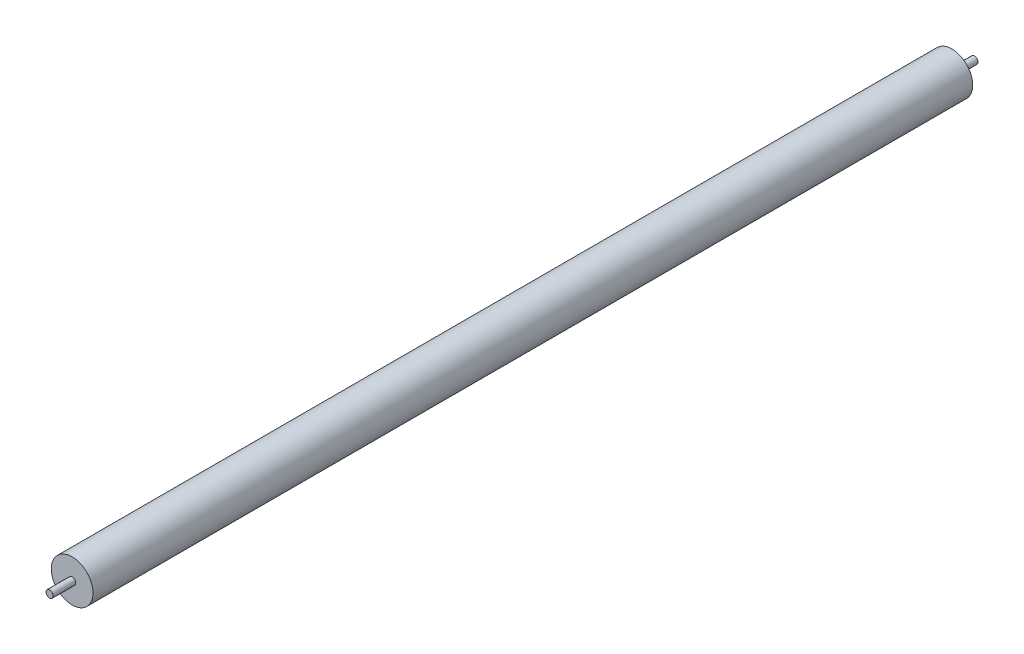
ISO-10303-21;
HEADER;
FILE_DESCRIPTION(('STEP AP214'),'2;1');
FILE_NAME('part.step','',(''),(''),'','','');
FILE_SCHEMA(('AUTOMOTIVE_DESIGN { 1 0 10303 214 1 1 1 1 }'));
ENDSEC;
DATA;
#1=APPLICATION_CONTEXT('core data for automotive mechanical design processes');
#2=APPLICATION_PROTOCOL_DEFINITION('international standard','automotive_design',2000,#1);
#3=PRODUCT_CONTEXT('',#1,'mechanical');
#4=PRODUCT('Part','Part','',(#3));
#5=PRODUCT_RELATED_PRODUCT_CATEGORY('part','',(#4));
#6=PRODUCT_DEFINITION_FORMATION('','',#4);
#7=PRODUCT_DEFINITION_CONTEXT('part definition',#1,'design');
#8=PRODUCT_DEFINITION('design','',#6,#7);
#9=PRODUCT_DEFINITION_SHAPE('','',#8);
#10=(LENGTH_UNIT() NAMED_UNIT(*) SI_UNIT(.MILLI.,.METRE.));
#11=(NAMED_UNIT(*) PLANE_ANGLE_UNIT() SI_UNIT($,.RADIAN.));
#12=(NAMED_UNIT(*) SI_UNIT($,.STERADIAN.) SOLID_ANGLE_UNIT());
#13=UNCERTAINTY_MEASURE_WITH_UNIT(LENGTH_MEASURE(1.E-05),#10,'distance_accuracy_value','');
#14=(GEOMETRIC_REPRESENTATION_CONTEXT(3) GLOBAL_UNCERTAINTY_ASSIGNED_CONTEXT((#13)) GLOBAL_UNIT_ASSIGNED_CONTEXT((#10,
#11,#12)) REPRESENTATION_CONTEXT('',''));
#15=CARTESIAN_POINT('',(0.,0.,0.));
#16=DIRECTION('',(0.,0.,1.));
#17=DIRECTION('',(1.,0.,0.));
#18=AXIS2_PLACEMENT_3D('',#15,#16,#17);
#19=CARTESIAN_POINT('',(0.,0.,390.));
#20=DIRECTION('',(0.,0.,-1.));
#21=DIRECTION('',(-1.,0.,0.));
#22=AXIS2_PLACEMENT_3D('',#19,#20,#21);
#23=CYLINDRICAL_SURFACE('',#22,18.5);
#24=CARTESIAN_POINT('',(0.,0.,390.));
#25=DIRECTION('',(0.,0.,1.));
#26=DIRECTION('',(1.,0.,0.));
#27=AXIS2_PLACEMENT_3D('',#24,#25,#26);
#28=CIRCLE('',#27,18.5);
#29=CARTESIAN_POINT('',(18.5,0.,390.));
#30=VERTEX_POINT('',#29);
#31=EDGE_CURVE('E36',#30,#30,#28,.T.);
#32=ORIENTED_EDGE('',*,*,#31,.F.);
#33=EDGE_LOOP('',(#32));
#34=FACE_BOUND('',#33,.T.);
#35=CARTESIAN_POINT('',(0.,0.,-390.));
#36=DIRECTION('',(0.,0.,1.));
#37=DIRECTION('',(1.,0.,0.));
#38=AXIS2_PLACEMENT_3D('',#35,#36,#37);
#39=CIRCLE('',#38,18.5);
#40=CARTESIAN_POINT('',(18.5,0.,-390.));
#41=VERTEX_POINT('',#40);
#42=EDGE_CURVE('E40',#41,#41,#39,.T.);
#43=ORIENTED_EDGE('',*,*,#42,.T.);
#44=EDGE_LOOP('',(#43));
#45=FACE_BOUND('',#44,.T.);
#46=ADVANCED_FACE('F30',(#34,#45),#23,.T.);
#47=CARTESIAN_POINT('',(0.,0.,390.));
#48=DIRECTION('',(0.,0.,1.));
#49=DIRECTION('',(1.,0.,0.));
#50=AXIS2_PLACEMENT_3D('',#47,#48,#49);
#51=PLANE('',#50);
#52=CARTESIAN_POINT('',(0.,0.,390.));
#53=DIRECTION('',(0.,0.,1.));
#54=DIRECTION('',(1.,0.,0.));
#55=AXIS2_PLACEMENT_3D('',#52,#53,#54);
#56=CIRCLE('',#55,3.175);
#57=CARTESIAN_POINT('',(-3.175,0.,390.));
#58=VERTEX_POINT('',#57);
#59=EDGE_CURVE('E45',#58,#58,#56,.F.);
#60=ORIENTED_EDGE('',*,*,#59,.T.);
#61=EDGE_LOOP('',(#60));
#62=FACE_BOUND('',#61,.T.);
#63=ORIENTED_EDGE('',*,*,#31,.T.);
#64=EDGE_LOOP('',(#63));
#65=FACE_BOUND('',#64,.T.);
#66=ADVANCED_FACE('F74',(#62,#65),#51,.T.);
#67=CARTESIAN_POINT('',(0.,0.,-390.));
#68=DIRECTION('',(0.,0.,1.));
#69=DIRECTION('',(1.,0.,0.));
#70=AXIS2_PLACEMENT_3D('',#67,#68,#69);
#71=PLANE('',#70);
#72=CARTESIAN_POINT('',(0.,0.,-390.));
#73=DIRECTION('',(0.,0.,1.));
#74=DIRECTION('',(1.,0.,0.));
#75=AXIS2_PLACEMENT_3D('',#72,#73,#74);
#76=CIRCLE('',#75,3.175);
#77=CARTESIAN_POINT('',(-3.175,0.,-390.));
#78=VERTEX_POINT('',#77);
#79=EDGE_CURVE('E10',#78,#78,#76,.F.);
#80=ORIENTED_EDGE('',*,*,#79,.F.);
#81=EDGE_LOOP('',(#80));
#82=FACE_BOUND('',#81,.T.);
#83=ORIENTED_EDGE('',*,*,#42,.F.);
#84=EDGE_LOOP('',(#83));
#85=FACE_BOUND('',#84,.T.);
#86=ADVANCED_FACE('F79',(#82,#85),#71,.F.);
#87=CARTESIAN_POINT('',(0.,0.,-410.));
#88=DIRECTION('',(0.,0.,1.));
#89=DIRECTION('',(1.,0.,0.));
#90=AXIS2_PLACEMENT_3D('',#87,#88,#89);
#91=PLANE('',#90);
#92=CARTESIAN_POINT('',(0.,0.,-410.));
#93=DIRECTION('',(0.,0.,1.));
#94=DIRECTION('',(1.,0.,0.));
#95=AXIS2_PLACEMENT_3D('',#92,#93,#94);
#96=CIRCLE('',#95,3.175);
#97=CARTESIAN_POINT('',(-3.175,0.,-410.));
#98=VERTEX_POINT('',#97);
#99=EDGE_CURVE('E50',#98,#98,#96,.T.);
#100=ORIENTED_EDGE('',*,*,#99,.F.);
#101=EDGE_LOOP('',(#100));
#102=FACE_BOUND('',#101,.T.);
#103=ADVANCED_FACE('F68',(#102),#91,.F.);
#104=CARTESIAN_POINT('',(0.,0.,410.));
#105=DIRECTION('',(0.,0.,-1.));
#106=DIRECTION('',(-1.,0.,0.));
#107=AXIS2_PLACEMENT_3D('',#104,#105,#106);
#108=CYLINDRICAL_SURFACE('',#107,3.175);
#109=CARTESIAN_POINT('',(-3.175,0.,-410.));
#110=CARTESIAN_POINT('',(-3.175,0.,-409.791666666667));
#111=CARTESIAN_POINT('',(-3.175,0.,-409.583333333333));
#112=CARTESIAN_POINT('',(-3.175,0.,-409.166666666667));
#113=CARTESIAN_POINT('',(-3.175,0.,-408.958333333333));
#114=CARTESIAN_POINT('',(-3.175,0.,-408.541666666667));
#115=CARTESIAN_POINT('',(-3.175,0.,-408.333333333333));
#116=CARTESIAN_POINT('',(-3.175,0.,-407.916666666667));
#117=CARTESIAN_POINT('',(-3.175,0.,-407.708333333333));
#118=CARTESIAN_POINT('',(-3.175,0.,-407.291666666667));
#119=CARTESIAN_POINT('',(-3.175,0.,-407.083333333333));
#120=CARTESIAN_POINT('',(-3.175,0.,-406.666666666667));
#121=CARTESIAN_POINT('',(-3.175,0.,-406.458333333333));
#122=CARTESIAN_POINT('',(-3.175,0.,-406.041666666667));
#123=CARTESIAN_POINT('',(-3.175,0.,-405.833333333333));
#124=CARTESIAN_POINT('',(-3.175,0.,-405.416666666667));
#125=CARTESIAN_POINT('',(-3.175,0.,-405.208333333333));
#126=CARTESIAN_POINT('',(-3.175,0.,-404.791666666667));
#127=CARTESIAN_POINT('',(-3.175,0.,-404.583333333333));
#128=CARTESIAN_POINT('',(-3.175,0.,-404.166666666667));
#129=CARTESIAN_POINT('',(-3.175,0.,-403.958333333333));
#130=CARTESIAN_POINT('',(-3.175,0.,-403.541666666667));
#131=CARTESIAN_POINT('',(-3.175,0.,-403.333333333333));
#132=CARTESIAN_POINT('',(-3.175,0.,-402.916666666667));
#133=CARTESIAN_POINT('',(-3.175,0.,-402.708333333333));
#134=CARTESIAN_POINT('',(-3.175,0.,-402.291666666667));
#135=CARTESIAN_POINT('',(-3.175,0.,-402.083333333333));
#136=CARTESIAN_POINT('',(-3.175,0.,-401.666666666667));
#137=CARTESIAN_POINT('',(-3.175,0.,-401.458333333333));
#138=CARTESIAN_POINT('',(-3.175,0.,-401.041666666667));
#139=CARTESIAN_POINT('',(-3.175,0.,-400.833333333333));
#140=CARTESIAN_POINT('',(-3.175,0.,-400.416666666667));
#141=CARTESIAN_POINT('',(-3.175,0.,-400.208333333333));
#142=CARTESIAN_POINT('',(-3.175,0.,-399.791666666667));
#143=CARTESIAN_POINT('',(-3.175,0.,-399.583333333333));
#144=CARTESIAN_POINT('',(-3.175,0.,-399.166666666667));
#145=CARTESIAN_POINT('',(-3.175,0.,-398.958333333333));
#146=CARTESIAN_POINT('',(-3.175,0.,-398.541666666667));
#147=CARTESIAN_POINT('',(-3.175,0.,-398.333333333333));
#148=CARTESIAN_POINT('',(-3.175,0.,-397.916666666667));
#149=CARTESIAN_POINT('',(-3.175,0.,-397.708333333333));
#150=CARTESIAN_POINT('',(-3.175,0.,-397.291666666667));
#151=CARTESIAN_POINT('',(-3.175,0.,-397.083333333333));
#152=CARTESIAN_POINT('',(-3.175,0.,-396.666666666667));
#153=CARTESIAN_POINT('',(-3.175,0.,-396.458333333333));
#154=CARTESIAN_POINT('',(-3.175,0.,-396.041666666667));
#155=CARTESIAN_POINT('',(-3.175,0.,-395.833333333333));
#156=CARTESIAN_POINT('',(-3.175,0.,-395.416666666667));
#157=CARTESIAN_POINT('',(-3.175,0.,-395.208333333333));
#158=CARTESIAN_POINT('',(-3.175,0.,-394.791666666667));
#159=CARTESIAN_POINT('',(-3.175,0.,-394.583333333333));
#160=CARTESIAN_POINT('',(-3.175,0.,-394.166666666667));
#161=CARTESIAN_POINT('',(-3.175,0.,-393.958333333333));
#162=CARTESIAN_POINT('',(-3.175,0.,-393.541666666667));
#163=CARTESIAN_POINT('',(-3.175,0.,-393.333333333333));
#164=CARTESIAN_POINT('',(-3.175,0.,-392.916666666667));
#165=CARTESIAN_POINT('',(-3.175,0.,-392.708333333333));
#166=CARTESIAN_POINT('',(-3.175,0.,-392.291666666667));
#167=CARTESIAN_POINT('',(-3.175,0.,-392.083333333333));
#168=CARTESIAN_POINT('',(-3.175,0.,-391.666666666667));
#169=CARTESIAN_POINT('',(-3.175,0.,-391.458333333333));
#170=CARTESIAN_POINT('',(-3.175,0.,-391.041666666667));
#171=CARTESIAN_POINT('',(-3.175,0.,-390.833333333333));
#172=CARTESIAN_POINT('',(-3.175,0.,-390.416666666667));
#173=CARTESIAN_POINT('',(-3.175,0.,-390.208333333333));
#174=CARTESIAN_POINT('',(-3.175,0.,-390.));
#175=B_SPLINE_CURVE_WITH_KNOTS('',3,(#109,#110,#111,#112,#113,#114,#115,#116,#117,#118,#119,
#120,#121,#122,#123,#124,#125,#126,#127,#128,#129,#130,#131,#132,#133,#134,#135,#136,#137,#138,
#139,#140,#141,#142,#143,#144,#145,#146,#147,#148,#149,#150,#151,#152,#153,#154,#155,#156,#157,
#158,#159,#160,#161,#162,#163,#164,#165,#166,#167,#168,#169,#170,#171,#172,#173,#174),
.UNSPECIFIED.,.F.,.F.,(4,2,2,2,2,2,2,2,2,2,2,2,2,2,2,2,2,2,2,2,2,2,2,2,2,2,2,2,2,2,2,2,4),(0.,
0.624999999999987,1.24999999999997,1.87499999999996,2.49999999999995,3.12499999999993,
3.74999999999992,4.37499999999991,4.99999999999989,5.62499999999999,6.24999999999998,
6.87499999999996,7.49999999999995,8.12499999999994,8.74999999999993,9.37499999999991,
9.9999999999999,10.6249999999999,11.2499999999999,11.8749999999999,12.4999999999998,
13.1249999999998,13.7499999999998,14.3749999999998,14.9999999999999,15.6249999999999,
16.2499999999999,16.8749999999999,17.4999999999999,18.1249999999998,18.7499999999998,
19.3749999999998,19.9999999999998),.UNSPECIFIED.);
#176=EDGE_CURVE('BSEAM60',#98,#78,#175,.T.);
#177=ORIENTED_EDGE('',*,*,#99,.T.);
#178=ORIENTED_EDGE('',*,*,#79,.T.);
#179=ORIENTED_EDGE('',*,*,#176,.T.);
#180=ORIENTED_EDGE('',*,*,#176,.F.);
#181=EDGE_LOOP('',(#177,#179,#178,#180));
#182=FACE_BOUND('',#181,.T.);
#183=ADVANCED_FACE('F60',(#182),#108,.T.);
#184=CARTESIAN_POINT('',(0.,0.,410.));
#185=DIRECTION('',(0.,0.,1.));
#186=DIRECTION('',(1.,0.,0.));
#187=AXIS2_PLACEMENT_3D('',#184,#185,#186);
#188=CIRCLE('',#187,3.175);
#189=CARTESIAN_POINT('',(-3.175,0.,410.));
#190=VERTEX_POINT('',#189);
#191=EDGE_CURVE('E49',#190,#190,#188,.T.);
#192=CARTESIAN_POINT('',(-3.175,0.,390.));
#193=CARTESIAN_POINT('',(-3.175,0.,390.208333333333));
#194=CARTESIAN_POINT('',(-3.175,0.,390.416666666667));
#195=CARTESIAN_POINT('',(-3.175,0.,390.833333333333));
#196=CARTESIAN_POINT('',(-3.175,0.,391.041666666667));
#197=CARTESIAN_POINT('',(-3.175,0.,391.458333333333));
#198=CARTESIAN_POINT('',(-3.175,0.,391.666666666667));
#199=CARTESIAN_POINT('',(-3.175,0.,392.083333333333));
#200=CARTESIAN_POINT('',(-3.175,0.,392.291666666667));
#201=CARTESIAN_POINT('',(-3.175,0.,392.708333333333));
#202=CARTESIAN_POINT('',(-3.175,0.,392.916666666667));
#203=CARTESIAN_POINT('',(-3.175,0.,393.333333333333));
#204=CARTESIAN_POINT('',(-3.175,0.,393.541666666667));
#205=CARTESIAN_POINT('',(-3.175,0.,393.958333333333));
#206=CARTESIAN_POINT('',(-3.175,0.,394.166666666667));
#207=CARTESIAN_POINT('',(-3.175,0.,394.583333333333));
#208=CARTESIAN_POINT('',(-3.175,0.,394.791666666667));
#209=CARTESIAN_POINT('',(-3.175,0.,395.208333333333));
#210=CARTESIAN_POINT('',(-3.175,0.,395.416666666667));
#211=CARTESIAN_POINT('',(-3.175,0.,395.833333333333));
#212=CARTESIAN_POINT('',(-3.175,0.,396.041666666667));
#213=CARTESIAN_POINT('',(-3.175,0.,396.458333333333));
#214=CARTESIAN_POINT('',(-3.175,0.,396.666666666667));
#215=CARTESIAN_POINT('',(-3.175,0.,397.083333333333));
#216=CARTESIAN_POINT('',(-3.175,0.,397.291666666667));
#217=CARTESIAN_POINT('',(-3.175,0.,397.708333333333));
#218=CARTESIAN_POINT('',(-3.175,0.,397.916666666667));
#219=CARTESIAN_POINT('',(-3.175,0.,398.333333333333));
#220=CARTESIAN_POINT('',(-3.175,0.,398.541666666667));
#221=CARTESIAN_POINT('',(-3.175,0.,398.958333333333));
#222=CARTESIAN_POINT('',(-3.175,0.,399.166666666667));
#223=CARTESIAN_POINT('',(-3.175,0.,399.583333333333));
#224=CARTESIAN_POINT('',(-3.175,0.,399.791666666667));
#225=CARTESIAN_POINT('',(-3.175,0.,400.208333333333));
#226=CARTESIAN_POINT('',(-3.175,0.,400.416666666667));
#227=CARTESIAN_POINT('',(-3.175,0.,400.833333333333));
#228=CARTESIAN_POINT('',(-3.175,0.,401.041666666667));
#229=CARTESIAN_POINT('',(-3.175,0.,401.458333333333));
#230=CARTESIAN_POINT('',(-3.175,0.,401.666666666667));
#231=CARTESIAN_POINT('',(-3.175,0.,402.083333333333));
#232=CARTESIAN_POINT('',(-3.175,0.,402.291666666667));
#233=CARTESIAN_POINT('',(-3.175,0.,402.708333333333));
#234=CARTESIAN_POINT('',(-3.175,0.,402.916666666667));
#235=CARTESIAN_POINT('',(-3.175,0.,403.333333333333));
#236=CARTESIAN_POINT('',(-3.175,0.,403.541666666667));
#237=CARTESIAN_POINT('',(-3.175,0.,403.958333333333));
#238=CARTESIAN_POINT('',(-3.175,0.,404.166666666667));
#239=CARTESIAN_POINT('',(-3.175,0.,404.583333333333));
#240=CARTESIAN_POINT('',(-3.175,0.,404.791666666667));
#241=CARTESIAN_POINT('',(-3.175,0.,405.208333333333));
#242=CARTESIAN_POINT('',(-3.175,0.,405.416666666667));
#243=CARTESIAN_POINT('',(-3.175,0.,405.833333333333));
#244=CARTESIAN_POINT('',(-3.175,0.,406.041666666667));
#245=CARTESIAN_POINT('',(-3.175,0.,406.458333333333));
#246=CARTESIAN_POINT('',(-3.175,0.,406.666666666667));
#247=CARTESIAN_POINT('',(-3.175,0.,407.083333333333));
#248=CARTESIAN_POINT('',(-3.175,0.,407.291666666667));
#249=CARTESIAN_POINT('',(-3.175,0.,407.708333333333));
#250=CARTESIAN_POINT('',(-3.175,0.,407.916666666667));
#251=CARTESIAN_POINT('',(-3.175,0.,408.333333333333));
#252=CARTESIAN_POINT('',(-3.175,0.,408.541666666667));
#253=CARTESIAN_POINT('',(-3.175,0.,408.958333333333));
#254=CARTESIAN_POINT('',(-3.175,0.,409.166666666667));
#255=CARTESIAN_POINT('',(-3.175,0.,409.583333333333));
#256=CARTESIAN_POINT('',(-3.175,0.,409.791666666667));
#257=CARTESIAN_POINT('',(-3.175,0.,410.));
#258=B_SPLINE_CURVE_WITH_KNOTS('',3,(#192,#193,#194,#195,#196,#197,#198,#199,#200,#201,#202,
#203,#204,#205,#206,#207,#208,#209,#210,#211,#212,#213,#214,#215,#216,#217,#218,#219,#220,#221,
#222,#223,#224,#225,#226,#227,#228,#229,#230,#231,#232,#233,#234,#235,#236,#237,#238,#239,#240,
#241,#242,#243,#244,#245,#246,#247,#248,#249,#250,#251,#252,#253,#254,#255,#256,#257),
.UNSPECIFIED.,.F.,.F.,(4,2,2,2,2,2,2,2,2,2,2,2,2,2,2,2,2,2,2,2,2,2,2,2,2,2,2,2,2,2,2,2,4),(0.,
0.625000000000042,1.25000000000003,1.87500000000002,2.5,3.12500000000004,3.75000000000003,
4.37500000000002,5.,5.62499999999999,6.25000000000003,6.87500000000002,7.50000000000001,
8.12499999999999,8.75000000000004,9.37500000000002,10.,10.625,11.25,11.875,12.5,13.125,13.75,
14.375,15.,15.625,16.25,16.875,17.5,18.125,18.75,19.375,20.),.UNSPECIFIED.);
#259=EDGE_CURVE('BSEAM58',#58,#190,#258,.T.);
#260=ORIENTED_EDGE('',*,*,#59,.F.);
#261=ORIENTED_EDGE('',*,*,#191,.F.);
#262=ORIENTED_EDGE('',*,*,#259,.T.);
#263=ORIENTED_EDGE('',*,*,#259,.F.);
#264=EDGE_LOOP('',(#260,#262,#261,#263));
#265=FACE_BOUND('',#264,.T.);
#266=ADVANCED_FACE('F58',(#265),#108,.T.);
#267=CARTESIAN_POINT('',(0.,0.,410.));
#268=DIRECTION('',(0.,0.,1.));
#269=DIRECTION('',(1.,0.,0.));
#270=AXIS2_PLACEMENT_3D('',#267,#268,#269);
#271=PLANE('',#270);
#272=ORIENTED_EDGE('',*,*,#191,.T.);
#273=EDGE_LOOP('',(#272));
#274=FACE_BOUND('',#273,.T.);
#275=ADVANCED_FACE('F56',(#274),#271,.T.);
#276=CLOSED_SHELL('',(#46,#66,#86,#103,#183,#266,#275));
#277=MANIFOLD_SOLID_BREP('B2',#276);
#278=ADVANCED_BREP_SHAPE_REPRESENTATION('',(#18,#277),#14);
#279=SHAPE_DEFINITION_REPRESENTATION(#9,#278);
ENDSEC;
END-ISO-10303-21;
